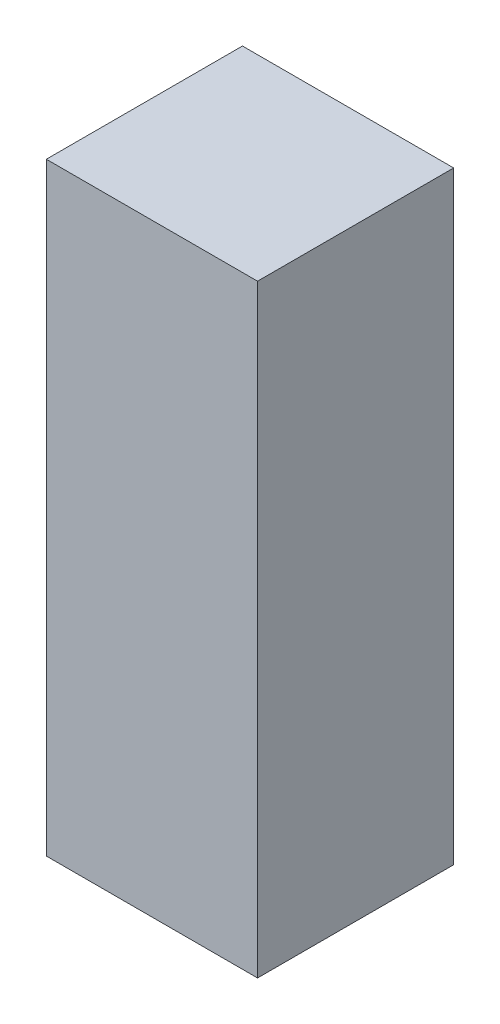
ISO-10303-21;
HEADER;
FILE_DESCRIPTION(('STEP AP214'),'2;1');
FILE_NAME('part.step','',(''),(''),'','','');
FILE_SCHEMA(('AUTOMOTIVE_DESIGN { 1 0 10303 214 1 1 1 1 }'));
ENDSEC;
DATA;
#1=APPLICATION_CONTEXT('core data for automotive mechanical design processes');
#2=APPLICATION_PROTOCOL_DEFINITION('international standard','automotive_design',2000,#1);
#3=PRODUCT_CONTEXT('',#1,'mechanical');
#4=PRODUCT('Part','Part','',(#3));
#5=PRODUCT_RELATED_PRODUCT_CATEGORY('part','',(#4));
#6=PRODUCT_DEFINITION_FORMATION('','',#4);
#7=PRODUCT_DEFINITION_CONTEXT('part definition',#1,'design');
#8=PRODUCT_DEFINITION('design','',#6,#7);
#9=PRODUCT_DEFINITION_SHAPE('','',#8);
#10=(LENGTH_UNIT() NAMED_UNIT(*) SI_UNIT(.MILLI.,.METRE.));
#11=(NAMED_UNIT(*) PLANE_ANGLE_UNIT() SI_UNIT($,.RADIAN.));
#12=(NAMED_UNIT(*) SI_UNIT($,.STERADIAN.) SOLID_ANGLE_UNIT());
#13=UNCERTAINTY_MEASURE_WITH_UNIT(LENGTH_MEASURE(1.E-05),#10,'distance_accuracy_value','');
#14=(GEOMETRIC_REPRESENTATION_CONTEXT(3) GLOBAL_UNCERTAINTY_ASSIGNED_CONTEXT((#13)) GLOBAL_UNIT_ASSIGNED_CONTEXT((#10,
#11,#12)) REPRESENTATION_CONTEXT('',''));
#15=CARTESIAN_POINT('',(0.,0.,0.));
#16=DIRECTION('',(0.,0.,1.));
#17=DIRECTION('',(1.,0.,0.));
#18=AXIS2_PLACEMENT_3D('',#15,#16,#17);
#19=CARTESIAN_POINT('',(24.,1700.,33.));
#20=DIRECTION('',(1.,0.,0.));
#21=DIRECTION('',(0.,0.,-1.));
#22=AXIS2_PLACEMENT_3D('',#19,#20,#21);
#23=PLANE('',#22);
#24=DIRECTION('',(0.,-1.,0.));
#25=VECTOR('',#24,1.);
#26=CARTESIAN_POINT('',(24.,1700.,20.));
#27=LINE('',#26,#25);
#28=CARTESIAN_POINT('',(24.,1740.,20.));
#29=VERTEX_POINT('',#28);
#30=CARTESIAN_POINT('',(24.,1700.,20.));
#31=VERTEX_POINT('',#30);
#32=EDGE_CURVE('E102',#29,#31,#27,.T.);
#33=ORIENTED_EDGE('',*,*,#32,.T.);
#34=DIRECTION('',(0.,0.,-1.));
#35=VECTOR('',#34,1.);
#36=CARTESIAN_POINT('',(24.,1700.,33.));
#37=LINE('',#36,#35);
#38=CARTESIAN_POINT('',(24.,1700.,33.));
#39=VERTEX_POINT('',#38);
#40=EDGE_CURVE('E11',#39,#31,#37,.T.);
#41=ORIENTED_EDGE('',*,*,#40,.F.);
#42=DIRECTION('',(0.,-1.,0.));
#43=VECTOR('',#42,1.);
#44=CARTESIAN_POINT('',(24.,1700.,33.));
#45=LINE('',#44,#43);
#46=CARTESIAN_POINT('',(24.,1740.,33.));
#47=VERTEX_POINT('',#46);
#48=EDGE_CURVE('E90',#47,#39,#45,.T.);
#49=ORIENTED_EDGE('',*,*,#48,.F.);
#50=DIRECTION('',(0.,0.,-1.));
#51=VECTOR('',#50,1.);
#52=CARTESIAN_POINT('',(24.,1740.,33.));
#53=LINE('',#52,#51);
#54=EDGE_CURVE('E98',#47,#29,#53,.T.);
#55=ORIENTED_EDGE('',*,*,#54,.T.);
#56=EDGE_LOOP('',(#33,#41,#49,#55));
#57=FACE_BOUND('',#56,.T.);
#58=ADVANCED_FACE('F39',(#57),#23,.F.);
#59=CARTESIAN_POINT('',(24.,1700.,33.));
#60=DIRECTION('',(0.,1.,0.));
#61=DIRECTION('',(0.,0.,1.));
#62=AXIS2_PLACEMENT_3D('',#59,#60,#61);
#63=PLANE('',#62);
#64=DIRECTION('',(1.,0.,0.));
#65=VECTOR('',#64,1.);
#66=CARTESIAN_POINT('',(24.,1700.,20.));
#67=LINE('',#66,#65);
#68=CARTESIAN_POINT('',(38.,1700.,20.));
#69=VERTEX_POINT('',#68);
#70=EDGE_CURVE('E94',#31,#69,#67,.T.);
#71=ORIENTED_EDGE('',*,*,#70,.T.);
#72=DIRECTION('',(0.,0.,-1.));
#73=VECTOR('',#72,1.);
#74=CARTESIAN_POINT('',(38.,1700.,33.));
#75=LINE('',#74,#73);
#76=CARTESIAN_POINT('',(38.,1700.,33.));
#77=VERTEX_POINT('',#76);
#78=EDGE_CURVE('E47',#77,#69,#75,.T.);
#79=ORIENTED_EDGE('',*,*,#78,.F.);
#80=DIRECTION('',(1.,0.,0.));
#81=VECTOR('',#80,1.);
#82=CARTESIAN_POINT('',(24.,1700.,33.));
#83=LINE('',#82,#81);
#84=EDGE_CURVE('E85',#39,#77,#83,.T.);
#85=ORIENTED_EDGE('',*,*,#84,.F.);
#86=ORIENTED_EDGE('',*,*,#40,.T.);
#87=EDGE_LOOP('',(#71,#79,#85,#86));
#88=FACE_BOUND('',#87,.T.);
#89=ADVANCED_FACE('F93',(#88),#63,.F.);
#90=CARTESIAN_POINT('',(38.,1700.,33.));
#91=DIRECTION('',(-1.,0.,0.));
#92=DIRECTION('',(0.,0.,1.));
#93=AXIS2_PLACEMENT_3D('',#90,#91,#92);
#94=PLANE('',#93);
#95=DIRECTION('',(0.,1.,0.));
#96=VECTOR('',#95,1.);
#97=CARTESIAN_POINT('',(38.,1700.,20.));
#98=LINE('',#97,#96);
#99=CARTESIAN_POINT('',(38.,1740.,20.));
#100=VERTEX_POINT('',#99);
#101=EDGE_CURVE('E72',#69,#100,#98,.T.);
#102=ORIENTED_EDGE('',*,*,#101,.T.);
#103=DIRECTION('',(0.,0.,-1.));
#104=VECTOR('',#103,1.);
#105=CARTESIAN_POINT('',(38.,1740.,33.));
#106=LINE('',#105,#104);
#107=CARTESIAN_POINT('',(38.,1740.,33.));
#108=VERTEX_POINT('',#107);
#109=EDGE_CURVE('E95',#108,#100,#106,.T.);
#110=ORIENTED_EDGE('',*,*,#109,.F.);
#111=DIRECTION('',(0.,1.,0.));
#112=VECTOR('',#111,1.);
#113=CARTESIAN_POINT('',(38.,1700.,33.));
#114=LINE('',#113,#112);
#115=EDGE_CURVE('E88',#77,#108,#114,.T.);
#116=ORIENTED_EDGE('',*,*,#115,.F.);
#117=ORIENTED_EDGE('',*,*,#78,.T.);
#118=EDGE_LOOP('',(#102,#110,#116,#117));
#119=FACE_BOUND('',#118,.T.);
#120=ADVANCED_FACE('F96',(#119),#94,.F.);
#121=CARTESIAN_POINT('',(24.,1740.,33.));
#122=DIRECTION('',(0.,-1.,0.));
#123=DIRECTION('',(0.,0.,-1.));
#124=AXIS2_PLACEMENT_3D('',#121,#122,#123);
#125=PLANE('',#124);
#126=DIRECTION('',(-1.,0.,0.));
#127=VECTOR('',#126,1.);
#128=CARTESIAN_POINT('',(24.,1740.,20.));
#129=LINE('',#128,#127);
#130=EDGE_CURVE('E78',#100,#29,#129,.T.);
#131=ORIENTED_EDGE('',*,*,#130,.T.);
#132=ORIENTED_EDGE('',*,*,#54,.F.);
#133=DIRECTION('',(-1.,0.,0.));
#134=VECTOR('',#133,1.);
#135=CARTESIAN_POINT('',(24.,1740.,33.));
#136=LINE('',#135,#134);
#137=EDGE_CURVE('E55',#108,#47,#136,.T.);
#138=ORIENTED_EDGE('',*,*,#137,.F.);
#139=ORIENTED_EDGE('',*,*,#109,.T.);
#140=EDGE_LOOP('',(#131,#132,#138,#139));
#141=FACE_BOUND('',#140,.T.);
#142=ADVANCED_FACE('F109',(#141),#125,.F.);
#143=CARTESIAN_POINT('',(0.,0.,33.));
#144=DIRECTION('',(0.,0.,-1.));
#145=DIRECTION('',(-1.,0.,0.));
#146=AXIS2_PLACEMENT_3D('',#143,#144,#145);
#147=PLANE('',#146);
#148=ORIENTED_EDGE('',*,*,#48,.T.);
#149=ORIENTED_EDGE('',*,*,#84,.T.);
#150=ORIENTED_EDGE('',*,*,#115,.T.);
#151=ORIENTED_EDGE('',*,*,#137,.T.);
#152=EDGE_LOOP('',(#148,#149,#150,#151));
#153=FACE_BOUND('',#152,.T.);
#154=ADVANCED_FACE('F86',(#153),#147,.F.);
#155=CARTESIAN_POINT('',(0.,0.,20.));
#156=DIRECTION('',(0.,0.,-1.));
#157=DIRECTION('',(-1.,0.,0.));
#158=AXIS2_PLACEMENT_3D('',#155,#156,#157);
#159=PLANE('',#158);
#160=ORIENTED_EDGE('',*,*,#32,.F.);
#161=ORIENTED_EDGE('',*,*,#130,.F.);
#162=ORIENTED_EDGE('',*,*,#101,.F.);
#163=ORIENTED_EDGE('',*,*,#70,.F.);
#164=EDGE_LOOP('',(#160,#161,#162,#163));
#165=FACE_BOUND('',#164,.T.);
#166=ADVANCED_FACE('F112',(#165),#159,.T.);
#167=CLOSED_SHELL('',(#58,#89,#120,#142,#154,#166));
#168=MANIFOLD_SOLID_BREP('B2',#167);
#169=ADVANCED_BREP_SHAPE_REPRESENTATION('',(#18,#168),#14);
#170=SHAPE_DEFINITION_REPRESENTATION(#9,#169);
ENDSEC;
END-ISO-10303-21;
